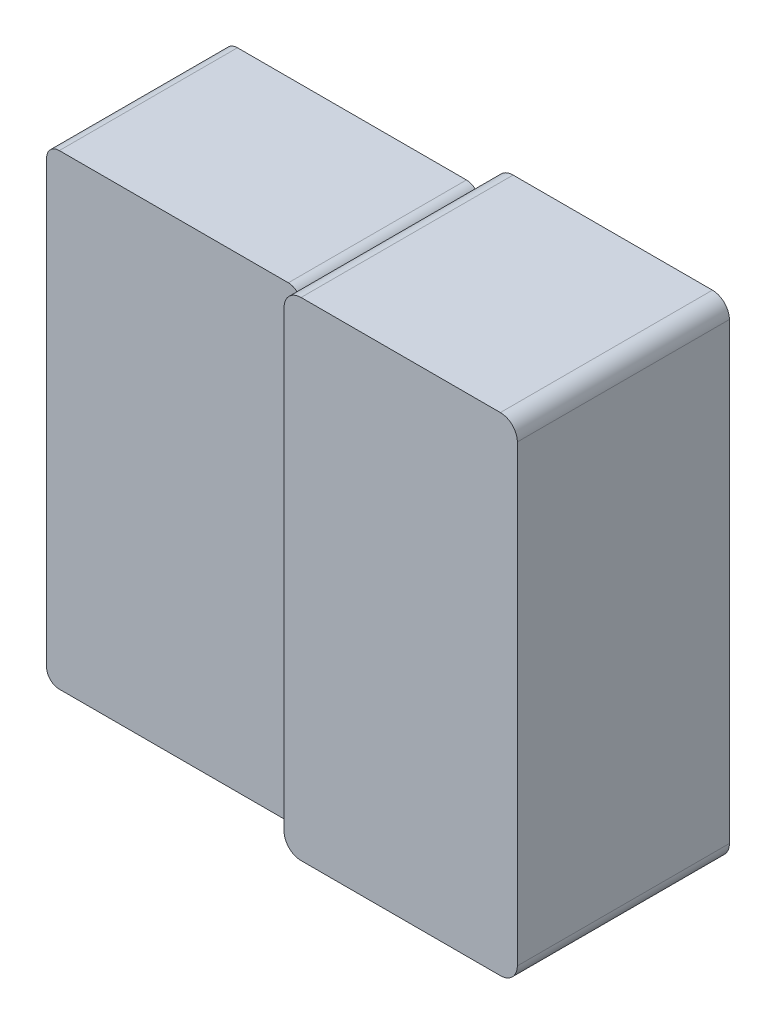
ISO-10303-21;
HEADER;
FILE_DESCRIPTION(('STEP AP214'),'2;1');
FILE_NAME('part.step','',(''),(''),'','','');
FILE_SCHEMA(('AUTOMOTIVE_DESIGN { 1 0 10303 214 1 1 1 1 }'));
ENDSEC;
DATA;
#1=APPLICATION_CONTEXT('core data for automotive mechanical design processes');
#2=APPLICATION_PROTOCOL_DEFINITION('international standard','automotive_design',2000,#1);
#3=PRODUCT_CONTEXT('',#1,'mechanical');
#4=PRODUCT('Part','Part','',(#3));
#5=PRODUCT_RELATED_PRODUCT_CATEGORY('part','',(#4));
#6=PRODUCT_DEFINITION_FORMATION('','',#4);
#7=PRODUCT_DEFINITION_CONTEXT('part definition',#1,'design');
#8=PRODUCT_DEFINITION('design','',#6,#7);
#9=PRODUCT_DEFINITION_SHAPE('','',#8);
#10=(LENGTH_UNIT() NAMED_UNIT(*) SI_UNIT(.MILLI.,.METRE.));
#11=(NAMED_UNIT(*) PLANE_ANGLE_UNIT() SI_UNIT($,.RADIAN.));
#12=(NAMED_UNIT(*) SI_UNIT($,.STERADIAN.) SOLID_ANGLE_UNIT());
#13=UNCERTAINTY_MEASURE_WITH_UNIT(LENGTH_MEASURE(1.E-05),#10,'distance_accuracy_value','');
#14=(GEOMETRIC_REPRESENTATION_CONTEXT(3) GLOBAL_UNCERTAINTY_ASSIGNED_CONTEXT((#13)) GLOBAL_UNIT_ASSIGNED_CONTEXT((#10,
#11,#12)) REPRESENTATION_CONTEXT('',''));
#15=CARTESIAN_POINT('',(0.,0.,0.));
#16=DIRECTION('',(0.,0.,1.));
#17=DIRECTION('',(1.,0.,0.));
#18=AXIS2_PLACEMENT_3D('',#15,#16,#17);
#19=CARTESIAN_POINT('',(-9.6,-5.35,5.));
#20=DIRECTION('',(0.,0.,-1.));
#21=DIRECTION('',(-1.,0.,0.));
#22=AXIS2_PLACEMENT_3D('',#19,#20,#21);
#23=CYLINDRICAL_SURFACE('',#22,0.400000000000001);
#24=CARTESIAN_POINT('',(-9.6,-5.35,0.));
#25=DIRECTION('',(0.,0.,1.));
#26=DIRECTION('',(1.,0.,0.));
#27=AXIS2_PLACEMENT_3D('',#24,#25,#26);
#28=CIRCLE('',#27,0.400000000000001);
#29=CARTESIAN_POINT('',(-10.,-5.35,0.));
#30=VERTEX_POINT('',#29);
#31=CARTESIAN_POINT('',(-9.6,-5.75,0.));
#32=VERTEX_POINT('',#31);
#33=EDGE_CURVE('E176',#30,#32,#28,.T.);
#34=ORIENTED_EDGE('',*,*,#33,.T.);
#35=DIRECTION('',(0.,0.,-1.));
#36=VECTOR('',#35,1.);
#37=CARTESIAN_POINT('',(-9.6,-5.75,5.));
#38=LINE('',#37,#36);
#39=CARTESIAN_POINT('',(-9.6,-5.75,5.));
#40=VERTEX_POINT('',#39);
#41=EDGE_CURVE('E11',#40,#32,#38,.T.);
#42=ORIENTED_EDGE('',*,*,#41,.F.);
#43=CARTESIAN_POINT('',(-9.6,-5.35,5.));
#44=DIRECTION('',(0.,0.,1.));
#45=DIRECTION('',(1.,0.,0.));
#46=AXIS2_PLACEMENT_3D('',#43,#44,#45);
#47=CIRCLE('',#46,0.400000000000001);
#48=CARTESIAN_POINT('',(-10.,-5.35,5.));
#49=VERTEX_POINT('',#48);
#50=EDGE_CURVE('E185',#49,#40,#47,.T.);
#51=ORIENTED_EDGE('',*,*,#50,.F.);
#52=DIRECTION('',(0.,0.,-1.));
#53=VECTOR('',#52,1.);
#54=CARTESIAN_POINT('',(-10.,-5.35,5.));
#55=LINE('',#54,#53);
#56=EDGE_CURVE('E202',#49,#30,#55,.T.);
#57=ORIENTED_EDGE('',*,*,#56,.T.);
#58=EDGE_LOOP('',(#34,#42,#51,#57));
#59=FACE_BOUND('',#58,.T.);
#60=ADVANCED_FACE('F41',(#59),#23,.T.);
#61=CARTESIAN_POINT('',(-9.6,-5.75,5.));
#62=DIRECTION('',(0.,1.,0.));
#63=DIRECTION('',(0.,0.,1.));
#64=AXIS2_PLACEMENT_3D('',#61,#62,#63);
#65=PLANE('',#64);
#66=DIRECTION('',(1.,0.,0.));
#67=VECTOR('',#66,1.);
#68=CARTESIAN_POINT('',(-9.6,-5.75,0.));
#69=LINE('',#68,#67);
#70=CARTESIAN_POINT('',(-4.9,-5.75,0.));
#71=VERTEX_POINT('',#70);
#72=EDGE_CURVE('E179',#32,#71,#69,.T.);
#73=ORIENTED_EDGE('',*,*,#72,.T.);
#74=DIRECTION('',(0.,0.,-1.));
#75=VECTOR('',#74,1.);
#76=CARTESIAN_POINT('',(-4.9,-5.75,5.));
#77=LINE('',#76,#75);
#78=CARTESIAN_POINT('',(-4.9,-5.75,5.));
#79=VERTEX_POINT('',#78);
#80=EDGE_CURVE('E48',#79,#71,#77,.T.);
#81=ORIENTED_EDGE('',*,*,#80,.F.);
#82=DIRECTION('',(1.,0.,0.));
#83=VECTOR('',#82,1.);
#84=CARTESIAN_POINT('',(-9.6,-5.75,5.));
#85=LINE('',#84,#83);
#86=EDGE_CURVE('E188',#40,#79,#85,.T.);
#87=ORIENTED_EDGE('',*,*,#86,.F.);
#88=ORIENTED_EDGE('',*,*,#41,.T.);
#89=EDGE_LOOP('',(#73,#81,#87,#88));
#90=FACE_BOUND('',#89,.T.);
#91=ADVANCED_FACE('F260',(#90),#65,.F.);
#92=CARTESIAN_POINT('',(-4.9,-5.35,5.));
#93=DIRECTION('',(0.,0.,-1.));
#94=DIRECTION('',(-1.,0.,0.));
#95=AXIS2_PLACEMENT_3D('',#92,#93,#94);
#96=CYLINDRICAL_SURFACE('',#95,0.400000000000001);
#97=CARTESIAN_POINT('',(-4.9,-5.35,0.));
#98=DIRECTION('',(0.,0.,1.));
#99=DIRECTION('',(1.,0.,0.));
#100=AXIS2_PLACEMENT_3D('',#97,#98,#99);
#101=CIRCLE('',#100,0.400000000000001);
#102=CARTESIAN_POINT('',(-4.5,-5.35,0.));
#103=VERTEX_POINT('',#102);
#104=EDGE_CURVE('E205',#71,#103,#101,.T.);
#105=ORIENTED_EDGE('',*,*,#104,.T.);
#106=DIRECTION('',(0.,0.,-1.));
#107=VECTOR('',#106,1.);
#108=CARTESIAN_POINT('',(-4.5,-5.35,5.));
#109=LINE('',#108,#107);
#110=CARTESIAN_POINT('',(-4.5,-5.35,5.));
#111=VERTEX_POINT('',#110);
#112=EDGE_CURVE('E230',#111,#103,#109,.T.);
#113=ORIENTED_EDGE('',*,*,#112,.F.);
#114=CARTESIAN_POINT('',(-4.9,-5.35,5.));
#115=DIRECTION('',(0.,0.,1.));
#116=DIRECTION('',(1.,0.,0.));
#117=AXIS2_PLACEMENT_3D('',#114,#115,#116);
#118=CIRCLE('',#117,0.400000000000001);
#119=EDGE_CURVE('E191',#79,#111,#118,.T.);
#120=ORIENTED_EDGE('',*,*,#119,.F.);
#121=ORIENTED_EDGE('',*,*,#80,.T.);
#122=EDGE_LOOP('',(#105,#113,#120,#121));
#123=FACE_BOUND('',#122,.T.);
#124=ADVANCED_FACE('F237',(#123),#96,.T.);
#125=CARTESIAN_POINT('',(-4.5,-5.35,5.));
#126=DIRECTION('',(-1.,0.,0.));
#127=DIRECTION('',(0.,0.,1.));
#128=AXIS2_PLACEMENT_3D('',#125,#126,#127);
#129=PLANE('',#128);
#130=DIRECTION('',(0.,1.,0.));
#131=VECTOR('',#130,1.);
#132=CARTESIAN_POINT('',(-4.5,-5.35,0.));
#133=LINE('',#132,#131);
#134=CARTESIAN_POINT('',(-4.5,5.35,0.));
#135=VERTEX_POINT('',#134);
#136=EDGE_CURVE('E207',#103,#135,#133,.T.);
#137=ORIENTED_EDGE('',*,*,#136,.T.);
#138=DIRECTION('',(0.,0.,-1.));
#139=VECTOR('',#138,1.);
#140=CARTESIAN_POINT('',(-4.5,5.35,5.));
#141=LINE('',#140,#139);
#142=CARTESIAN_POINT('',(-4.5,5.35,5.));
#143=VERTEX_POINT('',#142);
#144=EDGE_CURVE('E227',#143,#135,#141,.T.);
#145=ORIENTED_EDGE('',*,*,#144,.F.);
#146=DIRECTION('',(0.,1.,0.));
#147=VECTOR('',#146,1.);
#148=CARTESIAN_POINT('',(-4.5,-5.35,5.));
#149=LINE('',#148,#147);
#150=EDGE_CURVE('E193',#111,#143,#149,.T.);
#151=ORIENTED_EDGE('',*,*,#150,.F.);
#152=ORIENTED_EDGE('',*,*,#112,.T.);
#153=EDGE_LOOP('',(#137,#145,#151,#152));
#154=FACE_BOUND('',#153,.T.);
#155=ADVANCED_FACE('F248',(#154),#129,.F.);
#156=CARTESIAN_POINT('',(-4.9,5.35,5.));
#157=DIRECTION('',(0.,0.,-1.));
#158=DIRECTION('',(-1.,0.,0.));
#159=AXIS2_PLACEMENT_3D('',#156,#157,#158);
#160=CYLINDRICAL_SURFACE('',#159,0.400000000000001);
#161=CARTESIAN_POINT('',(-4.9,5.35,0.));
#162=DIRECTION('',(0.,0.,1.));
#163=DIRECTION('',(1.,0.,0.));
#164=AXIS2_PLACEMENT_3D('',#161,#162,#163);
#165=CIRCLE('',#164,0.400000000000001);
#166=CARTESIAN_POINT('',(-4.9,5.75,0.));
#167=VERTEX_POINT('',#166);
#168=EDGE_CURVE('E209',#135,#167,#165,.T.);
#169=ORIENTED_EDGE('',*,*,#168,.T.);
#170=DIRECTION('',(0.,0.,-1.));
#171=VECTOR('',#170,1.);
#172=CARTESIAN_POINT('',(-4.9,5.75,5.));
#173=LINE('',#172,#171);
#174=CARTESIAN_POINT('',(-4.9,5.75,5.));
#175=VERTEX_POINT('',#174);
#176=EDGE_CURVE('E224',#175,#167,#173,.T.);
#177=ORIENTED_EDGE('',*,*,#176,.F.);
#178=CARTESIAN_POINT('',(-4.9,5.35,5.));
#179=DIRECTION('',(0.,0.,1.));
#180=DIRECTION('',(1.,0.,0.));
#181=AXIS2_PLACEMENT_3D('',#178,#179,#180);
#182=CIRCLE('',#181,0.400000000000001);
#183=EDGE_CURVE('E195',#143,#175,#182,.T.);
#184=ORIENTED_EDGE('',*,*,#183,.F.);
#185=ORIENTED_EDGE('',*,*,#144,.T.);
#186=EDGE_LOOP('',(#169,#177,#184,#185));
#187=FACE_BOUND('',#186,.T.);
#188=ADVANCED_FACE('F252',(#187),#160,.T.);
#189=CARTESIAN_POINT('',(-4.9,5.75,5.));
#190=DIRECTION('',(0.,-1.,0.));
#191=DIRECTION('',(0.,0.,-1.));
#192=AXIS2_PLACEMENT_3D('',#189,#190,#191);
#193=PLANE('',#192);
#194=DIRECTION('',(-1.,0.,0.));
#195=VECTOR('',#194,1.);
#196=CARTESIAN_POINT('',(-4.9,5.75,0.));
#197=LINE('',#196,#195);
#198=CARTESIAN_POINT('',(-9.6,5.75,0.));
#199=VERTEX_POINT('',#198);
#200=EDGE_CURVE('E211',#167,#199,#197,.T.);
#201=ORIENTED_EDGE('',*,*,#200,.T.);
#202=DIRECTION('',(0.,0.,-1.));
#203=VECTOR('',#202,1.);
#204=CARTESIAN_POINT('',(-9.6,5.75,5.));
#205=LINE('',#204,#203);
#206=CARTESIAN_POINT('',(-9.6,5.75,5.));
#207=VERTEX_POINT('',#206);
#208=EDGE_CURVE('E221',#207,#199,#205,.T.);
#209=ORIENTED_EDGE('',*,*,#208,.F.);
#210=DIRECTION('',(-1.,0.,0.));
#211=VECTOR('',#210,1.);
#212=CARTESIAN_POINT('',(-4.9,5.75,5.));
#213=LINE('',#212,#211);
#214=EDGE_CURVE('E197',#175,#207,#213,.T.);
#215=ORIENTED_EDGE('',*,*,#214,.F.);
#216=ORIENTED_EDGE('',*,*,#176,.T.);
#217=EDGE_LOOP('',(#201,#209,#215,#216));
#218=FACE_BOUND('',#217,.T.);
#219=ADVANCED_FACE('F273',(#218),#193,.F.);
#220=CARTESIAN_POINT('',(-9.6,5.35,5.));
#221=DIRECTION('',(0.,0.,-1.));
#222=DIRECTION('',(-1.,0.,0.));
#223=AXIS2_PLACEMENT_3D('',#220,#221,#222);
#224=CYLINDRICAL_SURFACE('',#223,0.400000000000001);
#225=CARTESIAN_POINT('',(-9.6,5.35,0.));
#226=DIRECTION('',(0.,0.,1.));
#227=DIRECTION('',(1.,0.,0.));
#228=AXIS2_PLACEMENT_3D('',#225,#226,#227);
#229=CIRCLE('',#228,0.400000000000001);
#230=CARTESIAN_POINT('',(-10.,5.35,0.));
#231=VERTEX_POINT('',#230);
#232=EDGE_CURVE('E213',#199,#231,#229,.T.);
#233=ORIENTED_EDGE('',*,*,#232,.T.);
#234=DIRECTION('',(0.,0.,-1.));
#235=VECTOR('',#234,1.);
#236=CARTESIAN_POINT('',(-10.,5.35,5.));
#237=LINE('',#236,#235);
#238=CARTESIAN_POINT('',(-10.,5.35,5.));
#239=VERTEX_POINT('',#238);
#240=EDGE_CURVE('E218',#239,#231,#237,.T.);
#241=ORIENTED_EDGE('',*,*,#240,.F.);
#242=CARTESIAN_POINT('',(-9.6,5.35,5.));
#243=DIRECTION('',(0.,0.,1.));
#244=DIRECTION('',(1.,0.,0.));
#245=AXIS2_PLACEMENT_3D('',#242,#243,#244);
#246=CIRCLE('',#245,0.400000000000001);
#247=EDGE_CURVE('E199',#207,#239,#246,.T.);
#248=ORIENTED_EDGE('',*,*,#247,.F.);
#249=ORIENTED_EDGE('',*,*,#208,.T.);
#250=EDGE_LOOP('',(#233,#241,#248,#249));
#251=FACE_BOUND('',#250,.T.);
#252=ADVANCED_FACE('F271',(#251),#224,.T.);
#253=CARTESIAN_POINT('',(-10.,5.35,5.));
#254=DIRECTION('',(1.,0.,0.));
#255=DIRECTION('',(0.,0.,-1.));
#256=AXIS2_PLACEMENT_3D('',#253,#254,#255);
#257=PLANE('',#256);
#258=DIRECTION('',(0.,0.,-1.));
#259=VECTOR('',#258,1.);
#260=CARTESIAN_POINT('',(-10.,5.2,4.6));
#261=LINE('',#260,#259);
#262=CARTESIAN_POINT('',(-10.,5.2,4.6));
#263=VERTEX_POINT('',#262);
#264=CARTESIAN_POINT('',(-10.,5.2,0.4));
#265=VERTEX_POINT('',#264);
#266=EDGE_CURVE('E60',#263,#265,#261,.T.);
#267=ORIENTED_EDGE('',*,*,#266,.F.);
#268=DIRECTION('',(0.,1.,0.));
#269=VECTOR('',#268,1.);
#270=CARTESIAN_POINT('',(-10.,-5.2,4.6));
#271=LINE('',#270,#269);
#272=CARTESIAN_POINT('',(-10.,-5.2,4.6));
#273=VERTEX_POINT('',#272);
#274=EDGE_CURVE('E55',#273,#263,#271,.T.);
#275=ORIENTED_EDGE('',*,*,#274,.F.);
#276=DIRECTION('',(0.,0.,-1.));
#277=VECTOR('',#276,1.);
#278=CARTESIAN_POINT('',(-10.,-5.2,4.6));
#279=LINE('',#278,#277);
#280=CARTESIAN_POINT('',(-10.,-5.2,0.4));
#281=VERTEX_POINT('',#280);
#282=EDGE_CURVE('E181',#273,#281,#279,.T.);
#283=ORIENTED_EDGE('',*,*,#282,.T.);
#284=DIRECTION('',(0.,1.,0.));
#285=VECTOR('',#284,1.);
#286=CARTESIAN_POINT('',(-10.,-5.2,0.4));
#287=LINE('',#286,#285);
#288=EDGE_CURVE('E435',#281,#265,#287,.T.);
#289=ORIENTED_EDGE('',*,*,#288,.T.);
#290=EDGE_LOOP('',(#267,#275,#283,#289));
#291=FACE_BOUND('',#290,.T.);
#292=DIRECTION('',(0.,-1.,0.));
#293=VECTOR('',#292,1.);
#294=CARTESIAN_POINT('',(-10.,5.35,0.));
#295=LINE('',#294,#293);
#296=EDGE_CURVE('E189',#231,#30,#295,.T.);
#297=ORIENTED_EDGE('',*,*,#296,.T.);
#298=ORIENTED_EDGE('',*,*,#56,.F.);
#299=DIRECTION('',(0.,-1.,0.));
#300=VECTOR('',#299,1.);
#301=CARTESIAN_POINT('',(-10.,5.35,5.));
#302=LINE('',#301,#300);
#303=EDGE_CURVE('E201',#239,#49,#302,.T.);
#304=ORIENTED_EDGE('',*,*,#303,.F.);
#305=ORIENTED_EDGE('',*,*,#240,.T.);
#306=EDGE_LOOP('',(#297,#298,#304,#305));
#307=FACE_BOUND('',#306,.T.);
#308=ADVANCED_FACE('F266',(#291,#307),#257,.F.);
#309=CARTESIAN_POINT('',(-9.6,-5.35,5.));
#310=DIRECTION('',(0.,0.,1.));
#311=DIRECTION('',(1.,0.,0.));
#312=AXIS2_PLACEMENT_3D('',#309,#310,#311);
#313=PLANE('',#312);
#314=ORIENTED_EDGE('',*,*,#50,.T.);
#315=ORIENTED_EDGE('',*,*,#86,.T.);
#316=ORIENTED_EDGE('',*,*,#119,.T.);
#317=ORIENTED_EDGE('',*,*,#150,.T.);
#318=ORIENTED_EDGE('',*,*,#183,.T.);
#319=ORIENTED_EDGE('',*,*,#214,.T.);
#320=ORIENTED_EDGE('',*,*,#247,.T.);
#321=ORIENTED_EDGE('',*,*,#303,.T.);
#322=EDGE_LOOP('',(#314,#315,#316,#317,#318,#319,#320,#321));
#323=FACE_BOUND('',#322,.T.);
#324=ADVANCED_FACE('F256',(#323),#313,.T.);
#325=CARTESIAN_POINT('',(-9.6,-5.35,0.));
#326=DIRECTION('',(0.,0.,1.));
#327=DIRECTION('',(1.,0.,0.));
#328=AXIS2_PLACEMENT_3D('',#325,#326,#327);
#329=PLANE('',#328);
#330=ORIENTED_EDGE('',*,*,#33,.F.);
#331=ORIENTED_EDGE('',*,*,#296,.F.);
#332=ORIENTED_EDGE('',*,*,#232,.F.);
#333=ORIENTED_EDGE('',*,*,#200,.F.);
#334=ORIENTED_EDGE('',*,*,#168,.F.);
#335=ORIENTED_EDGE('',*,*,#136,.F.);
#336=ORIENTED_EDGE('',*,*,#104,.F.);
#337=ORIENTED_EDGE('',*,*,#72,.F.);
#338=EDGE_LOOP('',(#330,#331,#332,#333,#334,#335,#336,#337));
#339=FACE_BOUND('',#338,.T.);
#340=ADVANCED_FACE('F243',(#339),#329,.F.);
#341=CARTESIAN_POINT('',(-15.7,-5.2,4.6));
#342=DIRECTION('',(0.,0.,-1.));
#343=DIRECTION('',(-1.,0.,0.));
#344=AXIS2_PLACEMENT_3D('',#341,#342,#343);
#345=CYLINDRICAL_SURFACE('',#344,0.300000000000003);
#346=CARTESIAN_POINT('',(-15.7,-5.2,0.4));
#347=DIRECTION('',(0.,0.,1.));
#348=DIRECTION('',(1.,0.,0.));
#349=AXIS2_PLACEMENT_3D('',#346,#347,#348);
#350=CIRCLE('',#349,0.300000000000003);
#351=CARTESIAN_POINT('',(-16.,-5.2,0.4));
#352=VERTEX_POINT('',#351);
#353=CARTESIAN_POINT('',(-15.7,-5.5,0.4));
#354=VERTEX_POINT('',#353);
#355=EDGE_CURVE('E175',#352,#354,#350,.T.);
#356=ORIENTED_EDGE('',*,*,#355,.T.);
#357=DIRECTION('',(0.,0.,-1.));
#358=VECTOR('',#357,1.);
#359=CARTESIAN_POINT('',(-15.7,-5.5,4.6));
#360=LINE('',#359,#358);
#361=CARTESIAN_POINT('',(-15.7,-5.5,4.6));
#362=VERTEX_POINT('',#361);
#363=EDGE_CURVE('E155',#362,#354,#360,.T.);
#364=ORIENTED_EDGE('',*,*,#363,.F.);
#365=CARTESIAN_POINT('',(-15.7,-5.2,4.6));
#366=DIRECTION('',(0.,0.,1.));
#367=DIRECTION('',(1.,0.,0.));
#368=AXIS2_PLACEMENT_3D('',#365,#366,#367);
#369=CIRCLE('',#368,0.300000000000003);
#370=CARTESIAN_POINT('',(-16.,-5.2,4.6));
#371=VERTEX_POINT('',#370);
#372=EDGE_CURVE('E162',#371,#362,#369,.T.);
#373=ORIENTED_EDGE('',*,*,#372,.F.);
#374=DIRECTION('',(0.,0.,-1.));
#375=VECTOR('',#374,1.);
#376=CARTESIAN_POINT('',(-16.,-5.2,4.6));
#377=LINE('',#376,#375);
#378=EDGE_CURVE('E444',#371,#352,#377,.T.);
#379=ORIENTED_EDGE('',*,*,#378,.T.);
#380=EDGE_LOOP('',(#356,#364,#373,#379));
#381=FACE_BOUND('',#380,.T.);
#382=ADVANCED_FACE('F173',(#381),#345,.T.);
#383=CARTESIAN_POINT('',(-15.7,-5.5,4.6));
#384=DIRECTION('',(0.,1.,0.));
#385=DIRECTION('',(0.,0.,1.));
#386=AXIS2_PLACEMENT_3D('',#383,#384,#385);
#387=PLANE('',#386);
#388=DIRECTION('',(1.,0.,0.));
#389=VECTOR('',#388,1.);
#390=CARTESIAN_POINT('',(-15.7,-5.5,0.4));
#391=LINE('',#390,#389);
#392=CARTESIAN_POINT('',(-10.3,-5.5,0.4));
#393=VERTEX_POINT('',#392);
#394=EDGE_CURVE('E426',#354,#393,#391,.T.);
#395=ORIENTED_EDGE('',*,*,#394,.T.);
#396=DIRECTION('',(0.,0.,-1.));
#397=VECTOR('',#396,1.);
#398=CARTESIAN_POINT('',(-10.3,-5.5,4.6));
#399=LINE('',#398,#397);
#400=CARTESIAN_POINT('',(-10.3,-5.5,4.6));
#401=VERTEX_POINT('',#400);
#402=EDGE_CURVE('E158',#401,#393,#399,.T.);
#403=ORIENTED_EDGE('',*,*,#402,.F.);
#404=DIRECTION('',(1.,0.,0.));
#405=VECTOR('',#404,1.);
#406=CARTESIAN_POINT('',(-15.7,-5.5,4.6));
#407=LINE('',#406,#405);
#408=EDGE_CURVE('E151',#362,#401,#407,.T.);
#409=ORIENTED_EDGE('',*,*,#408,.F.);
#410=ORIENTED_EDGE('',*,*,#363,.T.);
#411=EDGE_LOOP('',(#395,#403,#409,#410));
#412=FACE_BOUND('',#411,.T.);
#413=ADVANCED_FACE('F153',(#412),#387,.F.);
#414=CARTESIAN_POINT('',(-10.3,-5.2,4.6));
#415=DIRECTION('',(0.,0.,-1.));
#416=DIRECTION('',(-1.,0.,0.));
#417=AXIS2_PLACEMENT_3D('',#414,#415,#416);
#418=CYLINDRICAL_SURFACE('',#417,0.300000000000002);
#419=CARTESIAN_POINT('',(-10.3,-5.2,0.4));
#420=DIRECTION('',(0.,0.,1.));
#421=DIRECTION('',(1.,0.,0.));
#422=AXIS2_PLACEMENT_3D('',#419,#420,#421);
#423=CIRCLE('',#422,0.300000000000002);
#424=EDGE_CURVE('E428',#393,#281,#423,.T.);
#425=ORIENTED_EDGE('',*,*,#424,.T.);
#426=ORIENTED_EDGE('',*,*,#282,.F.);
#427=CARTESIAN_POINT('',(-10.3,-5.2,4.6));
#428=DIRECTION('',(0.,0.,1.));
#429=DIRECTION('',(1.,0.,0.));
#430=AXIS2_PLACEMENT_3D('',#427,#428,#429);
#431=CIRCLE('',#430,0.300000000000002);
#432=EDGE_CURVE('E161',#401,#273,#431,.T.);
#433=ORIENTED_EDGE('',*,*,#432,.F.);
#434=ORIENTED_EDGE('',*,*,#402,.T.);
#435=EDGE_LOOP('',(#425,#426,#433,#434));
#436=FACE_BOUND('',#435,.T.);
#437=ADVANCED_FACE('F353',(#436),#418,.T.);
#438=CARTESIAN_POINT('',(-10.3,5.2,4.6));
#439=DIRECTION('',(0.,0.,-1.));
#440=DIRECTION('',(-1.,0.,0.));
#441=AXIS2_PLACEMENT_3D('',#438,#439,#440);
#442=CYLINDRICAL_SURFACE('',#441,0.300000000000002);
#443=CARTESIAN_POINT('',(-10.3,5.2,0.4));
#444=DIRECTION('',(0.,0.,1.));
#445=DIRECTION('',(1.,0.,0.));
#446=AXIS2_PLACEMENT_3D('',#443,#444,#445);
#447=CIRCLE('',#446,0.300000000000002);
#448=CARTESIAN_POINT('',(-10.3,5.5,0.4));
#449=VERTEX_POINT('',#448);
#450=EDGE_CURVE('E437',#265,#449,#447,.T.);
#451=ORIENTED_EDGE('',*,*,#450,.T.);
#452=DIRECTION('',(0.,0.,-1.));
#453=VECTOR('',#452,1.);
#454=CARTESIAN_POINT('',(-10.3,5.5,4.6));
#455=LINE('',#454,#453);
#456=CARTESIAN_POINT('',(-10.3,5.5,4.6));
#457=VERTEX_POINT('',#456);
#458=EDGE_CURVE('E452',#457,#449,#455,.T.);
#459=ORIENTED_EDGE('',*,*,#458,.F.);
#460=CARTESIAN_POINT('',(-10.3,5.2,4.6));
#461=DIRECTION('',(0.,0.,1.));
#462=DIRECTION('',(1.,0.,0.));
#463=AXIS2_PLACEMENT_3D('',#460,#461,#462);
#464=CIRCLE('',#463,0.300000000000002);
#465=EDGE_CURVE('E466',#263,#457,#464,.T.);
#466=ORIENTED_EDGE('',*,*,#465,.F.);
#467=ORIENTED_EDGE('',*,*,#266,.T.);
#468=EDGE_LOOP('',(#451,#459,#466,#467));
#469=FACE_BOUND('',#468,.T.);
#470=ADVANCED_FACE('F362',(#469),#442,.T.);
#471=CARTESIAN_POINT('',(-10.3,5.5,4.6));
#472=DIRECTION('',(0.,-1.,0.));
#473=DIRECTION('',(0.,0.,-1.));
#474=AXIS2_PLACEMENT_3D('',#471,#472,#473);
#475=PLANE('',#474);
#476=DIRECTION('',(-1.,0.,0.));
#477=VECTOR('',#476,1.);
#478=CARTESIAN_POINT('',(-10.3,5.5,0.4));
#479=LINE('',#478,#477);
#480=CARTESIAN_POINT('',(-15.7,5.5,0.4));
#481=VERTEX_POINT('',#480);
#482=EDGE_CURVE('E439',#449,#481,#479,.T.);
#483=ORIENTED_EDGE('',*,*,#482,.T.);
#484=DIRECTION('',(0.,0.,-1.));
#485=VECTOR('',#484,1.);
#486=CARTESIAN_POINT('',(-15.7,5.5,4.6));
#487=LINE('',#486,#485);
#488=CARTESIAN_POINT('',(-15.7,5.5,4.6));
#489=VERTEX_POINT('',#488);
#490=EDGE_CURVE('E449',#489,#481,#487,.T.);
#491=ORIENTED_EDGE('',*,*,#490,.F.);
#492=DIRECTION('',(-1.,0.,0.));
#493=VECTOR('',#492,1.);
#494=CARTESIAN_POINT('',(-10.3,5.5,4.6));
#495=LINE('',#494,#493);
#496=EDGE_CURVE('E463',#457,#489,#495,.T.);
#497=ORIENTED_EDGE('',*,*,#496,.F.);
#498=ORIENTED_EDGE('',*,*,#458,.T.);
#499=EDGE_LOOP('',(#483,#491,#497,#498));
#500=FACE_BOUND('',#499,.T.);
#501=ADVANCED_FACE('F372',(#500),#475,.F.);
#502=CARTESIAN_POINT('',(-15.7,5.2,4.6));
#503=DIRECTION('',(0.,0.,-1.));
#504=DIRECTION('',(-1.,0.,0.));
#505=AXIS2_PLACEMENT_3D('',#502,#503,#504);
#506=CYLINDRICAL_SURFACE('',#505,0.300000000000003);
#507=CARTESIAN_POINT('',(-15.7,5.2,0.4));
#508=DIRECTION('',(0.,0.,1.));
#509=DIRECTION('',(1.,0.,0.));
#510=AXIS2_PLACEMENT_3D('',#507,#508,#509);
#511=CIRCLE('',#510,0.300000000000003);
#512=CARTESIAN_POINT('',(-16.,5.2,0.4));
#513=VERTEX_POINT('',#512);
#514=EDGE_CURVE('E441',#481,#513,#511,.T.);
#515=ORIENTED_EDGE('',*,*,#514,.T.);
#516=DIRECTION('',(0.,0.,-1.));
#517=VECTOR('',#516,1.);
#518=CARTESIAN_POINT('',(-16.,5.2,4.6));
#519=LINE('',#518,#517);
#520=CARTESIAN_POINT('',(-16.,5.2,4.6));
#521=VERTEX_POINT('',#520);
#522=EDGE_CURVE('E446',#521,#513,#519,.T.);
#523=ORIENTED_EDGE('',*,*,#522,.F.);
#524=CARTESIAN_POINT('',(-15.7,5.2,4.6));
#525=DIRECTION('',(0.,0.,1.));
#526=DIRECTION('',(1.,0.,0.));
#527=AXIS2_PLACEMENT_3D('',#524,#525,#526);
#528=CIRCLE('',#527,0.300000000000003);
#529=EDGE_CURVE('E465',#489,#521,#528,.T.);
#530=ORIENTED_EDGE('',*,*,#529,.F.);
#531=ORIENTED_EDGE('',*,*,#490,.T.);
#532=EDGE_LOOP('',(#515,#523,#530,#531));
#533=FACE_BOUND('',#532,.T.);
#534=ADVANCED_FACE('F382',(#533),#506,.T.);
#535=CARTESIAN_POINT('',(-16.,5.2,4.6));
#536=DIRECTION('',(1.,0.,0.));
#537=DIRECTION('',(0.,0.,-1.));
#538=AXIS2_PLACEMENT_3D('',#535,#536,#537);
#539=PLANE('',#538);
#540=DIRECTION('',(0.,-1.,0.));
#541=VECTOR('',#540,1.);
#542=CARTESIAN_POINT('',(-16.,5.2,0.4));
#543=LINE('',#542,#541);
#544=EDGE_CURVE('E171',#513,#352,#543,.T.);
#545=ORIENTED_EDGE('',*,*,#544,.T.);
#546=ORIENTED_EDGE('',*,*,#378,.F.);
#547=DIRECTION('',(0.,-1.,0.));
#548=VECTOR('',#547,1.);
#549=CARTESIAN_POINT('',(-16.,5.2,4.6));
#550=LINE('',#549,#548);
#551=EDGE_CURVE('E167',#521,#371,#550,.T.);
#552=ORIENTED_EDGE('',*,*,#551,.F.);
#553=ORIENTED_EDGE('',*,*,#522,.T.);
#554=EDGE_LOOP('',(#545,#546,#552,#553));
#555=FACE_BOUND('',#554,.T.);
#556=ADVANCED_FACE('F392',(#555),#539,.F.);
#557=CARTESIAN_POINT('',(-15.7,-5.2,4.6));
#558=DIRECTION('',(0.,0.,1.));
#559=DIRECTION('',(1.,0.,0.));
#560=AXIS2_PLACEMENT_3D('',#557,#558,#559);
#561=PLANE('',#560);
#562=ORIENTED_EDGE('',*,*,#372,.T.);
#563=ORIENTED_EDGE('',*,*,#408,.T.);
#564=ORIENTED_EDGE('',*,*,#432,.T.);
#565=ORIENTED_EDGE('',*,*,#274,.T.);
#566=ORIENTED_EDGE('',*,*,#465,.T.);
#567=ORIENTED_EDGE('',*,*,#496,.T.);
#568=ORIENTED_EDGE('',*,*,#529,.T.);
#569=ORIENTED_EDGE('',*,*,#551,.T.);
#570=EDGE_LOOP('',(#562,#563,#564,#565,#566,#567,#568,#569));
#571=FACE_BOUND('',#570,.T.);
#572=ADVANCED_FACE('F165',(#571),#561,.T.);
#573=CARTESIAN_POINT('',(-15.7,-5.2,0.4));
#574=DIRECTION('',(0.,0.,1.));
#575=DIRECTION('',(1.,0.,0.));
#576=AXIS2_PLACEMENT_3D('',#573,#574,#575);
#577=PLANE('',#576);
#578=ORIENTED_EDGE('',*,*,#355,.F.);
#579=ORIENTED_EDGE('',*,*,#544,.F.);
#580=ORIENTED_EDGE('',*,*,#514,.F.);
#581=ORIENTED_EDGE('',*,*,#482,.F.);
#582=ORIENTED_EDGE('',*,*,#450,.F.);
#583=ORIENTED_EDGE('',*,*,#288,.F.);
#584=ORIENTED_EDGE('',*,*,#424,.F.);
#585=ORIENTED_EDGE('',*,*,#394,.F.);
#586=EDGE_LOOP('',(#578,#579,#580,#581,#582,#583,#584,#585));
#587=FACE_BOUND('',#586,.T.);
#588=ADVANCED_FACE('F411',(#587),#577,.F.);
#589=CLOSED_SHELL('',(#60,#91,#124,#155,#188,#219,#252,#308,#324,#340,#382,#413,#437,#470,#501,
#534,#556,#572,#588));
#590=MANIFOLD_SOLID_BREP('B2',#589);
#591=ADVANCED_BREP_SHAPE_REPRESENTATION('',(#18,#590),#14);
#592=SHAPE_DEFINITION_REPRESENTATION(#9,#591);
ENDSEC;
END-ISO-10303-21;
